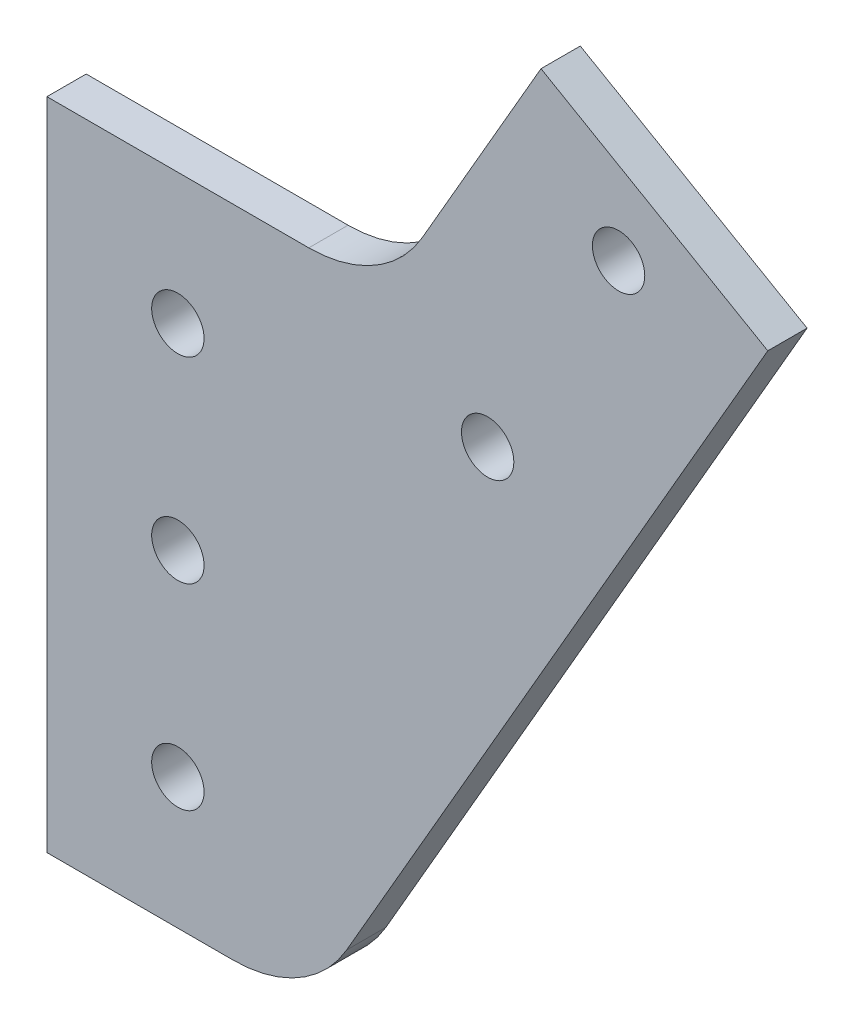
ISO-10303-21;
HEADER;
FILE_DESCRIPTION(('STEP AP214'),'2;1');
FILE_NAME('part.step','',(''),(''),'','','');
FILE_SCHEMA(('AUTOMOTIVE_DESIGN { 1 0 10303 214 1 1 1 1 }'));
ENDSEC;
DATA;
#1=APPLICATION_CONTEXT('core data for automotive mechanical design processes');
#2=APPLICATION_PROTOCOL_DEFINITION('international standard','automotive_design',2000,#1);
#3=PRODUCT_CONTEXT('',#1,'mechanical');
#4=PRODUCT('Part','Part','',(#3));
#5=PRODUCT_RELATED_PRODUCT_CATEGORY('part','',(#4));
#6=PRODUCT_DEFINITION_FORMATION('','',#4);
#7=PRODUCT_DEFINITION_CONTEXT('part definition',#1,'design');
#8=PRODUCT_DEFINITION('design','',#6,#7);
#9=PRODUCT_DEFINITION_SHAPE('','',#8);
#10=(LENGTH_UNIT() NAMED_UNIT(*) SI_UNIT(.MILLI.,.METRE.));
#11=(NAMED_UNIT(*) PLANE_ANGLE_UNIT() SI_UNIT($,.RADIAN.));
#12=(NAMED_UNIT(*) SI_UNIT($,.STERADIAN.) SOLID_ANGLE_UNIT());
#13=UNCERTAINTY_MEASURE_WITH_UNIT(LENGTH_MEASURE(1.E-05),#10,'distance_accuracy_value','');
#14=(GEOMETRIC_REPRESENTATION_CONTEXT(3) GLOBAL_UNCERTAINTY_ASSIGNED_CONTEXT((#13)) GLOBAL_UNIT_ASSIGNED_CONTEXT((#10,
#11,#12)) REPRESENTATION_CONTEXT('',''));
#15=CARTESIAN_POINT('',(0.,0.,0.));
#16=DIRECTION('',(0.,0.,1.));
#17=DIRECTION('',(1.,0.,0.));
#18=AXIS2_PLACEMENT_3D('',#15,#16,#17);
#19=CARTESIAN_POINT('',(18.3253175473055,-10.5801270189221,3.));
#20=DIRECTION('',(0.86602540378444,-0.499999999999998,0.));
#21=DIRECTION('',(0.499999999999998,0.86602540378444,0.));
#22=AXIS2_PLACEMENT_3D('',#19,#20,#21);
#23=PLANE('',#22);
#24=DIRECTION('',(-0.499999999999998,-0.86602540378444,0.));
#25=VECTOR('',#24,1.);
#26=CARTESIAN_POINT('',(18.3253175473055,-10.5801270189221,3.));
#27=LINE('',#26,#25);
#28=CARTESIAN_POINT('',(45.0561910604391,35.7191040365227,3.));
#29=VERTEX_POINT('',#28);
#30=CARTESIAN_POINT('',(12.8867513459481,-20.,3.));
#31=VERTEX_POINT('',#30);
#32=EDGE_CURVE('E109',#29,#31,#27,.T.);
#33=ORIENTED_EDGE('',*,*,#32,.T.);
#34=DIRECTION('',(0.,0.,-1.));
#35=VECTOR('',#34,1.);
#36=CARTESIAN_POINT('',(12.8867513459481,-20.,0.));
#37=LINE('',#36,#35);
#38=CARTESIAN_POINT('',(12.8867513459481,-20.,0.));
#39=VERTEX_POINT('',#38);
#40=EDGE_CURVE('E117',#31,#39,#37,.T.);
#41=ORIENTED_EDGE('',*,*,#40,.T.);
#42=DIRECTION('',(-0.499999999999998,-0.86602540378444,0.));
#43=VECTOR('',#42,1.);
#44=CARTESIAN_POINT('',(18.3253175473055,-10.5801270189221,0.));
#45=LINE('',#44,#43);
#46=CARTESIAN_POINT('',(45.0561910604391,35.7191040365227,0.));
#47=VERTEX_POINT('',#46);
#48=EDGE_CURVE('E112',#47,#39,#45,.T.);
#49=ORIENTED_EDGE('',*,*,#48,.F.);
#50=DIRECTION('',(0.,0.,-1.));
#51=VECTOR('',#50,1.);
#52=CARTESIAN_POINT('',(45.0561910604391,35.7191040365227,3.));
#53=LINE('',#52,#51);
#54=EDGE_CURVE('E106',#29,#47,#53,.T.);
#55=ORIENTED_EDGE('',*,*,#54,.F.);
#56=EDGE_LOOP('',(#33,#41,#49,#55));
#57=FACE_BOUND('',#56,.T.);
#58=ADVANCED_FACE('F39',(#57),#23,.T.);
#59=CARTESIAN_POINT('',(26.7308735131336,46.2992310554448,3.));
#60=DIRECTION('',(0.499999999999998,0.86602540378444,0.));
#61=DIRECTION('',(-0.86602540378444,0.499999999999998,0.));
#62=AXIS2_PLACEMENT_3D('',#59,#60,#61);
#63=PLANE('',#62);
#64=DIRECTION('',(0.86602540378444,-0.499999999999998,0.));
#65=VECTOR('',#64,1.);
#66=CARTESIAN_POINT('',(26.7308735131336,46.2992310554448,0.));
#67=LINE('',#66,#65);
#68=CARTESIAN_POINT('',(27.7356829847503,45.7191040365226,0.));
#69=VERTEX_POINT('',#68);
#70=EDGE_CURVE('E160',#69,#47,#67,.T.);
#71=ORIENTED_EDGE('',*,*,#70,.F.);
#72=DIRECTION('',(0.,0.,-1.));
#73=VECTOR('',#72,1.);
#74=CARTESIAN_POINT('',(27.7356829847503,45.7191040365226,3.));
#75=LINE('',#74,#73);
#76=CARTESIAN_POINT('',(27.7356829847503,45.7191040365226,3.));
#77=VERTEX_POINT('',#76);
#78=EDGE_CURVE('E118',#77,#69,#75,.T.);
#79=ORIENTED_EDGE('',*,*,#78,.F.);
#80=DIRECTION('',(0.86602540378444,-0.499999999999998,0.));
#81=VECTOR('',#80,1.);
#82=CARTESIAN_POINT('',(26.7308735131336,46.2992310554448,3.));
#83=LINE('',#82,#81);
#84=EDGE_CURVE('E124',#77,#29,#83,.T.);
#85=ORIENTED_EDGE('',*,*,#84,.T.);
#86=ORIENTED_EDGE('',*,*,#54,.T.);
#87=EDGE_LOOP('',(#71,#79,#85,#86));
#88=FACE_BOUND('',#87,.T.);
#89=ADVANCED_FACE('F130',(#88),#63,.T.);
#90=CARTESIAN_POINT('',(1.00480947161671,-0.580127018922188,3.));
#91=DIRECTION('',(-0.86602540378444,0.499999999999997,0.));
#92=DIRECTION('',(-0.499999999999997,-0.86602540378444,0.));
#93=AXIS2_PLACEMENT_3D('',#90,#91,#92);
#94=PLANE('',#93);
#95=DIRECTION('',(0.499999999999997,0.86602540378444,0.));
#96=VECTOR('',#95,1.);
#97=CARTESIAN_POINT('',(1.00480947161671,-0.580127018922188,0.));
#98=LINE('',#97,#96);
#99=CARTESIAN_POINT('',(18.6602540378443,30.,0.));
#100=VERTEX_POINT('',#99);
#101=EDGE_CURVE('E162',#100,#69,#98,.T.);
#102=ORIENTED_EDGE('',*,*,#101,.F.);
#103=DIRECTION('',(0.,0.,-1.));
#104=VECTOR('',#103,1.);
#105=CARTESIAN_POINT('',(18.6602540378443,30.,3.));
#106=LINE('',#105,#104);
#107=CARTESIAN_POINT('',(18.6602540378443,30.,3.));
#108=VERTEX_POINT('',#107);
#109=EDGE_CURVE('E54',#100,#108,#106,.F.);
#110=ORIENTED_EDGE('',*,*,#109,.T.);
#111=DIRECTION('',(0.499999999999997,0.86602540378444,0.));
#112=VECTOR('',#111,1.);
#113=CARTESIAN_POINT('',(1.00480947161671,-0.580127018922188,3.));
#114=LINE('',#113,#112);
#115=EDGE_CURVE('E132',#108,#77,#114,.T.);
#116=ORIENTED_EDGE('',*,*,#115,.T.);
#117=ORIENTED_EDGE('',*,*,#78,.T.);
#118=EDGE_LOOP('',(#102,#110,#116,#117));
#119=FACE_BOUND('',#118,.T.);
#120=ADVANCED_FACE('F205',(#119),#94,.T.);
#121=CARTESIAN_POINT('',(0.,25.,3.));
#122=DIRECTION('',(0.,1.,0.));
#123=DIRECTION('',(-1.,0.,0.));
#124=AXIS2_PLACEMENT_3D('',#121,#122,#123);
#125=PLANE('',#124);
#126=DIRECTION('',(1.,0.,0.));
#127=VECTOR('',#126,1.);
#128=CARTESIAN_POINT('',(0.,25.,0.));
#129=LINE('',#128,#127);
#130=CARTESIAN_POINT('',(-10.,25.,0.));
#131=VERTEX_POINT('',#130);
#132=CARTESIAN_POINT('',(10.,25.,0.));
#133=VERTEX_POINT('',#132);
#134=EDGE_CURVE('E164',#131,#133,#129,.T.);
#135=ORIENTED_EDGE('',*,*,#134,.F.);
#136=DIRECTION('',(0.,0.,-1.));
#137=VECTOR('',#136,1.);
#138=CARTESIAN_POINT('',(-10.,25.,3.));
#139=LINE('',#138,#137);
#140=CARTESIAN_POINT('',(-10.,25.,3.));
#141=VERTEX_POINT('',#140);
#142=EDGE_CURVE('E187',#141,#131,#139,.T.);
#143=ORIENTED_EDGE('',*,*,#142,.F.);
#144=DIRECTION('',(1.,0.,0.));
#145=VECTOR('',#144,1.);
#146=CARTESIAN_POINT('',(0.,25.,3.));
#147=LINE('',#146,#145);
#148=CARTESIAN_POINT('',(10.,25.,3.));
#149=VERTEX_POINT('',#148);
#150=EDGE_CURVE('E134',#141,#149,#147,.T.);
#151=ORIENTED_EDGE('',*,*,#150,.T.);
#152=DIRECTION('',(0.,0.,-1.));
#153=VECTOR('',#152,1.);
#154=CARTESIAN_POINT('',(10.,25.,3.));
#155=LINE('',#154,#153);
#156=EDGE_CURVE('E189',#149,#133,#155,.T.);
#157=ORIENTED_EDGE('',*,*,#156,.T.);
#158=EDGE_LOOP('',(#135,#143,#151,#157));
#159=FACE_BOUND('',#158,.T.);
#160=ADVANCED_FACE('F209',(#159),#125,.T.);
#161=CARTESIAN_POINT('',(-10.,0.,3.));
#162=DIRECTION('',(1.,0.,0.));
#163=DIRECTION('',(0.,1.,0.));
#164=AXIS2_PLACEMENT_3D('',#161,#162,#163);
#165=PLANE('',#164);
#166=DIRECTION('',(0.,-1.,0.));
#167=VECTOR('',#166,1.);
#168=CARTESIAN_POINT('',(-10.,0.,0.));
#169=LINE('',#168,#167);
#170=CARTESIAN_POINT('',(-10.,-25.,0.));
#171=VERTEX_POINT('',#170);
#172=EDGE_CURVE('E167',#131,#171,#169,.T.);
#173=ORIENTED_EDGE('',*,*,#172,.T.);
#174=DIRECTION('',(0.,0.,-1.));
#175=VECTOR('',#174,1.);
#176=CARTESIAN_POINT('',(-10.,-25.,3.));
#177=LINE('',#176,#175);
#178=CARTESIAN_POINT('',(-10.,-25.,3.));
#179=VERTEX_POINT('',#178);
#180=EDGE_CURVE('E158',#179,#171,#177,.T.);
#181=ORIENTED_EDGE('',*,*,#180,.F.);
#182=DIRECTION('',(0.,-1.,0.));
#183=VECTOR('',#182,1.);
#184=CARTESIAN_POINT('',(-10.,0.,3.));
#185=LINE('',#184,#183);
#186=EDGE_CURVE('E139',#141,#179,#185,.T.);
#187=ORIENTED_EDGE('',*,*,#186,.F.);
#188=ORIENTED_EDGE('',*,*,#142,.T.);
#189=EDGE_LOOP('',(#173,#181,#187,#188));
#190=FACE_BOUND('',#189,.T.);
#191=ADVANCED_FACE('F213',(#190),#165,.F.);
#192=CARTESIAN_POINT('',(33.6602540378443,35.9807621135334,3.));
#193=DIRECTION('',(0.,0.,-1.));
#194=DIRECTION('',(-1.,0.,0.));
#195=AXIS2_PLACEMENT_3D('',#192,#193,#194);
#196=CYLINDRICAL_SURFACE('',#195,2.);
#197=CARTESIAN_POINT('',(33.6602540378443,35.9807621135334,3.));
#198=DIRECTION('',(0.,0.,1.));
#199=DIRECTION('',(1.,0.,0.));
#200=AXIS2_PLACEMENT_3D('',#197,#198,#199);
#201=CIRCLE('',#200,2.);
#202=CARTESIAN_POINT('',(35.6602540378443,35.9807621135334,3.));
#203=VERTEX_POINT('',#202);
#204=EDGE_CURVE('E152',#203,#203,#201,.T.);
#205=ORIENTED_EDGE('',*,*,#204,.T.);
#206=EDGE_LOOP('',(#205));
#207=FACE_BOUND('',#206,.T.);
#208=CARTESIAN_POINT('',(33.6602540378443,35.9807621135334,0.));
#209=DIRECTION('',(0.,0.,1.));
#210=DIRECTION('',(1.,0.,0.));
#211=AXIS2_PLACEMENT_3D('',#208,#209,#210);
#212=CIRCLE('',#211,2.);
#213=CARTESIAN_POINT('',(35.6602540378443,35.9807621135334,0.));
#214=VERTEX_POINT('',#213);
#215=EDGE_CURVE('E180',#214,#214,#212,.T.);
#216=ORIENTED_EDGE('',*,*,#215,.F.);
#217=EDGE_LOOP('',(#216));
#218=FACE_BOUND('',#217,.T.);
#219=ADVANCED_FACE('F250',(#207,#218),#196,.F.);
#220=CARTESIAN_POINT('',(0.,14.9999999999999,3.));
#221=DIRECTION('',(0.,0.,-1.));
#222=DIRECTION('',(-1.,0.,0.));
#223=AXIS2_PLACEMENT_3D('',#220,#221,#222);
#224=CYLINDRICAL_SURFACE('',#223,2.);
#225=CARTESIAN_POINT('',(0.,14.9999999999999,3.));
#226=DIRECTION('',(0.,0.,1.));
#227=DIRECTION('',(1.,0.,0.));
#228=AXIS2_PLACEMENT_3D('',#225,#226,#227);
#229=CIRCLE('',#228,2.);
#230=CARTESIAN_POINT('',(2.,14.9999999999999,3.));
#231=VERTEX_POINT('',#230);
#232=EDGE_CURVE('E149',#231,#231,#229,.T.);
#233=ORIENTED_EDGE('',*,*,#232,.T.);
#234=EDGE_LOOP('',(#233));
#235=FACE_BOUND('',#234,.T.);
#236=CARTESIAN_POINT('',(0.,14.9999999999999,0.));
#237=DIRECTION('',(0.,0.,1.));
#238=DIRECTION('',(1.,0.,0.));
#239=AXIS2_PLACEMENT_3D('',#236,#237,#238);
#240=CIRCLE('',#239,2.);
#241=CARTESIAN_POINT('',(2.,14.9999999999999,0.));
#242=VERTEX_POINT('',#241);
#243=EDGE_CURVE('E177',#242,#242,#240,.T.);
#244=ORIENTED_EDGE('',*,*,#243,.F.);
#245=EDGE_LOOP('',(#244));
#246=FACE_BOUND('',#245,.T.);
#247=ADVANCED_FACE('F253',(#235,#246),#224,.F.);
#248=CARTESIAN_POINT('',(0.,-15.,3.));
#249=DIRECTION('',(0.,0.,-1.));
#250=DIRECTION('',(-1.,0.,0.));
#251=AXIS2_PLACEMENT_3D('',#248,#249,#250);
#252=CYLINDRICAL_SURFACE('',#251,2.);
#253=CARTESIAN_POINT('',(0.,-15.,3.));
#254=DIRECTION('',(0.,0.,1.));
#255=DIRECTION('',(1.,0.,0.));
#256=AXIS2_PLACEMENT_3D('',#253,#254,#255);
#257=CIRCLE('',#256,2.);
#258=CARTESIAN_POINT('',(2.,-15.,3.));
#259=VERTEX_POINT('',#258);
#260=EDGE_CURVE('E146',#259,#259,#257,.T.);
#261=ORIENTED_EDGE('',*,*,#260,.T.);
#262=EDGE_LOOP('',(#261));
#263=FACE_BOUND('',#262,.T.);
#264=CARTESIAN_POINT('',(0.,-15.,0.));
#265=DIRECTION('',(0.,0.,1.));
#266=DIRECTION('',(1.,0.,0.));
#267=AXIS2_PLACEMENT_3D('',#264,#265,#266);
#268=CIRCLE('',#267,2.);
#269=CARTESIAN_POINT('',(2.,-15.,0.));
#270=VERTEX_POINT('',#269);
#271=EDGE_CURVE('E174',#270,#270,#268,.T.);
#272=ORIENTED_EDGE('',*,*,#271,.F.);
#273=EDGE_LOOP('',(#272));
#274=FACE_BOUND('',#273,.T.);
#275=ADVANCED_FACE('F228',(#263,#274),#252,.F.);
#276=CARTESIAN_POINT('',(0.,0.,3.));
#277=DIRECTION('',(0.,0.,-1.));
#278=DIRECTION('',(-1.,0.,0.));
#279=AXIS2_PLACEMENT_3D('',#276,#277,#278);
#280=CYLINDRICAL_SURFACE('',#279,2.);
#281=CARTESIAN_POINT('',(0.,0.,3.));
#282=DIRECTION('',(0.,0.,1.));
#283=DIRECTION('',(1.,0.,0.));
#284=AXIS2_PLACEMENT_3D('',#281,#282,#283);
#285=CIRCLE('',#284,2.);
#286=CARTESIAN_POINT('',(2.,0.,3.));
#287=VERTEX_POINT('',#286);
#288=EDGE_CURVE('E143',#287,#287,#285,.T.);
#289=ORIENTED_EDGE('',*,*,#288,.T.);
#290=EDGE_LOOP('',(#289));
#291=FACE_BOUND('',#290,.T.);
#292=CARTESIAN_POINT('',(0.,0.,0.));
#293=DIRECTION('',(0.,0.,1.));
#294=DIRECTION('',(1.,0.,0.));
#295=AXIS2_PLACEMENT_3D('',#292,#293,#294);
#296=CIRCLE('',#295,2.);
#297=CARTESIAN_POINT('',(2.,0.,0.));
#298=VERTEX_POINT('',#297);
#299=EDGE_CURVE('E171',#298,#298,#296,.T.);
#300=ORIENTED_EDGE('',*,*,#299,.F.);
#301=EDGE_LOOP('',(#300));
#302=FACE_BOUND('',#301,.T.);
#303=ADVANCED_FACE('F220',(#291,#302),#280,.F.);
#304=CARTESIAN_POINT('',(0.,-25.,3.));
#305=DIRECTION('',(0.,1.,0.));
#306=DIRECTION('',(-1.,0.,0.));
#307=AXIS2_PLACEMENT_3D('',#304,#305,#306);
#308=PLANE('',#307);
#309=DIRECTION('',(1.,0.,0.));
#310=VECTOR('',#309,1.);
#311=CARTESIAN_POINT('',(0.,-25.,0.));
#312=LINE('',#311,#310);
#313=CARTESIAN_POINT('',(4.22649730810373,-25.,0.));
#314=VERTEX_POINT('',#313);
#315=EDGE_CURVE('E169',#171,#314,#312,.T.);
#316=ORIENTED_EDGE('',*,*,#315,.T.);
#317=DIRECTION('',(0.,0.,-1.));
#318=VECTOR('',#317,1.);
#319=CARTESIAN_POINT('',(4.22649730810373,-25.,3.));
#320=LINE('',#319,#318);
#321=CARTESIAN_POINT('',(4.22649730810373,-25.,3.));
#322=VERTEX_POINT('',#321);
#323=EDGE_CURVE('E62',#314,#322,#320,.F.);
#324=ORIENTED_EDGE('',*,*,#323,.T.);
#325=DIRECTION('',(1.,0.,0.));
#326=VECTOR('',#325,1.);
#327=CARTESIAN_POINT('',(0.,-25.,3.));
#328=LINE('',#327,#326);
#329=EDGE_CURVE('E141',#179,#322,#328,.T.);
#330=ORIENTED_EDGE('',*,*,#329,.F.);
#331=ORIENTED_EDGE('',*,*,#180,.T.);
#332=EDGE_LOOP('',(#316,#324,#330,#331));
#333=FACE_BOUND('',#332,.T.);
#334=ADVANCED_FACE('F217',(#333),#308,.F.);
#335=CARTESIAN_POINT('',(23.6602540378444,18.6602540378446,3.));
#336=DIRECTION('',(0.,0.,-1.));
#337=DIRECTION('',(-1.,0.,0.));
#338=AXIS2_PLACEMENT_3D('',#335,#336,#337);
#339=CYLINDRICAL_SURFACE('',#338,1.99999999999999);
#340=CARTESIAN_POINT('',(23.6602540378444,18.6602540378446,3.));
#341=DIRECTION('',(0.,0.,1.));
#342=DIRECTION('',(1.,0.,0.));
#343=AXIS2_PLACEMENT_3D('',#340,#341,#342);
#344=CIRCLE('',#343,1.99999999999999);
#345=CARTESIAN_POINT('',(25.6602540378444,18.6602540378446,3.));
#346=VERTEX_POINT('',#345);
#347=EDGE_CURVE('E155',#346,#346,#344,.T.);
#348=ORIENTED_EDGE('',*,*,#347,.T.);
#349=EDGE_LOOP('',(#348));
#350=FACE_BOUND('',#349,.T.);
#351=CARTESIAN_POINT('',(23.6602540378444,18.6602540378446,0.));
#352=DIRECTION('',(0.,0.,1.));
#353=DIRECTION('',(1.,0.,0.));
#354=AXIS2_PLACEMENT_3D('',#351,#352,#353);
#355=CIRCLE('',#354,1.99999999999999);
#356=CARTESIAN_POINT('',(25.6602540378444,18.6602540378446,0.));
#357=VERTEX_POINT('',#356);
#358=EDGE_CURVE('E127',#357,#357,#355,.T.);
#359=ORIENTED_EDGE('',*,*,#358,.F.);
#360=EDGE_LOOP('',(#359));
#361=FACE_BOUND('',#360,.T.);
#362=ADVANCED_FACE('F219',(#350,#361),#339,.F.);
#363=CARTESIAN_POINT('',(0.,0.,3.));
#364=DIRECTION('',(0.,0.,1.));
#365=DIRECTION('',(1.,0.,0.));
#366=AXIS2_PLACEMENT_3D('',#363,#364,#365);
#367=PLANE('',#366);
#368=ORIENTED_EDGE('',*,*,#329,.T.);
#369=CARTESIAN_POINT('',(4.22649730810372,-15.,3.));
#370=DIRECTION('',(0.,0.,1.));
#371=DIRECTION('',(1.,0.,0.));
#372=AXIS2_PLACEMENT_3D('',#369,#370,#371);
#373=CIRCLE('',#372,10.);
#374=EDGE_CURVE('E126',#322,#31,#373,.T.);
#375=ORIENTED_EDGE('',*,*,#374,.T.);
#376=ORIENTED_EDGE('',*,*,#32,.F.);
#377=ORIENTED_EDGE('',*,*,#84,.F.);
#378=ORIENTED_EDGE('',*,*,#115,.F.);
#379=CARTESIAN_POINT('',(9.99999999999986,35.,3.));
#380=DIRECTION('',(0.,0.,1.));
#381=DIRECTION('',(1.,0.,0.));
#382=AXIS2_PLACEMENT_3D('',#379,#380,#381);
#383=CIRCLE('',#382,10.);
#384=EDGE_CURVE('E11',#108,#149,#383,.F.);
#385=ORIENTED_EDGE('',*,*,#384,.T.);
#386=ORIENTED_EDGE('',*,*,#150,.F.);
#387=ORIENTED_EDGE('',*,*,#186,.T.);
#388=EDGE_LOOP('',(#368,#375,#376,#377,#378,#385,#386,#387));
#389=FACE_BOUND('',#388,.T.);
#390=ORIENTED_EDGE('',*,*,#288,.F.);
#391=EDGE_LOOP('',(#390));
#392=FACE_BOUND('',#391,.T.);
#393=ORIENTED_EDGE('',*,*,#260,.F.);
#394=EDGE_LOOP('',(#393));
#395=FACE_BOUND('',#394,.T.);
#396=ORIENTED_EDGE('',*,*,#232,.F.);
#397=EDGE_LOOP('',(#396));
#398=FACE_BOUND('',#397,.T.);
#399=ORIENTED_EDGE('',*,*,#204,.F.);
#400=EDGE_LOOP('',(#399));
#401=FACE_BOUND('',#400,.T.);
#402=ORIENTED_EDGE('',*,*,#347,.F.);
#403=EDGE_LOOP('',(#402));
#404=FACE_BOUND('',#403,.T.);
#405=ADVANCED_FACE('F122',(#389,#392,#395,#398,#401,#404),#367,.T.);
#406=CARTESIAN_POINT('',(0.,0.,0.));
#407=DIRECTION('',(0.,0.,1.));
#408=DIRECTION('',(1.,0.,0.));
#409=AXIS2_PLACEMENT_3D('',#406,#407,#408);
#410=PLANE('',#409);
#411=ORIENTED_EDGE('',*,*,#48,.T.);
#412=CARTESIAN_POINT('',(4.22649730810372,-15.,0.));
#413=DIRECTION('',(0.,0.,1.));
#414=DIRECTION('',(1.,0.,0.));
#415=AXIS2_PLACEMENT_3D('',#412,#413,#414);
#416=CIRCLE('',#415,10.);
#417=EDGE_CURVE('E194',#39,#314,#416,.F.);
#418=ORIENTED_EDGE('',*,*,#417,.T.);
#419=ORIENTED_EDGE('',*,*,#315,.F.);
#420=ORIENTED_EDGE('',*,*,#172,.F.);
#421=ORIENTED_EDGE('',*,*,#134,.T.);
#422=CARTESIAN_POINT('',(9.99999999999986,35.,0.));
#423=DIRECTION('',(0.,0.,1.));
#424=DIRECTION('',(1.,0.,0.));
#425=AXIS2_PLACEMENT_3D('',#422,#423,#424);
#426=CIRCLE('',#425,10.);
#427=EDGE_CURVE('E47',#133,#100,#426,.T.);
#428=ORIENTED_EDGE('',*,*,#427,.T.);
#429=ORIENTED_EDGE('',*,*,#101,.T.);
#430=ORIENTED_EDGE('',*,*,#70,.T.);
#431=EDGE_LOOP('',(#411,#418,#419,#420,#421,#428,#429,#430));
#432=FACE_BOUND('',#431,.T.);
#433=ORIENTED_EDGE('',*,*,#299,.T.);
#434=EDGE_LOOP('',(#433));
#435=FACE_BOUND('',#434,.T.);
#436=ORIENTED_EDGE('',*,*,#271,.T.);
#437=EDGE_LOOP('',(#436));
#438=FACE_BOUND('',#437,.T.);
#439=ORIENTED_EDGE('',*,*,#243,.T.);
#440=EDGE_LOOP('',(#439));
#441=FACE_BOUND('',#440,.T.);
#442=ORIENTED_EDGE('',*,*,#215,.T.);
#443=EDGE_LOOP('',(#442));
#444=FACE_BOUND('',#443,.T.);
#445=ORIENTED_EDGE('',*,*,#358,.T.);
#446=EDGE_LOOP('',(#445));
#447=FACE_BOUND('',#446,.T.);
#448=ADVANCED_FACE('F199',(#432,#435,#438,#441,#444,#447),#410,.F.);
#449=CARTESIAN_POINT('',(4.22649730810372,-15.,3.));
#450=DIRECTION('',(0.,0.,1.));
#451=DIRECTION('',(1.,0.,0.));
#452=AXIS2_PLACEMENT_3D('',#449,#450,#451);
#453=CYLINDRICAL_SURFACE('',#452,10.);
#454=ORIENTED_EDGE('',*,*,#374,.F.);
#455=ORIENTED_EDGE('',*,*,#323,.F.);
#456=ORIENTED_EDGE('',*,*,#417,.F.);
#457=ORIENTED_EDGE('',*,*,#40,.F.);
#458=EDGE_LOOP('',(#454,#455,#456,#457));
#459=FACE_BOUND('',#458,.T.);
#460=ADVANCED_FACE('F215',(#459),#453,.T.);
#461=CARTESIAN_POINT('',(9.99999999999986,35.,3.));
#462=DIRECTION('',(0.,0.,1.));
#463=DIRECTION('',(1.,0.,0.));
#464=AXIS2_PLACEMENT_3D('',#461,#462,#463);
#465=CYLINDRICAL_SURFACE('',#464,10.);
#466=ORIENTED_EDGE('',*,*,#384,.F.);
#467=ORIENTED_EDGE('',*,*,#109,.F.);
#468=ORIENTED_EDGE('',*,*,#427,.F.);
#469=ORIENTED_EDGE('',*,*,#156,.F.);
#470=EDGE_LOOP('',(#466,#467,#468,#469));
#471=FACE_BOUND('',#470,.T.);
#472=ADVANCED_FACE('F41',(#471),#465,.F.);
#473=CLOSED_SHELL('',(#58,#89,#120,#160,#191,#219,#247,#275,#303,#334,#362,#405,#448,#460,#472));
#474=MANIFOLD_SOLID_BREP('B2',#473);
#475=ADVANCED_BREP_SHAPE_REPRESENTATION('',(#18,#474),#14);
#476=SHAPE_DEFINITION_REPRESENTATION(#9,#475);
ENDSEC;
END-ISO-10303-21;
